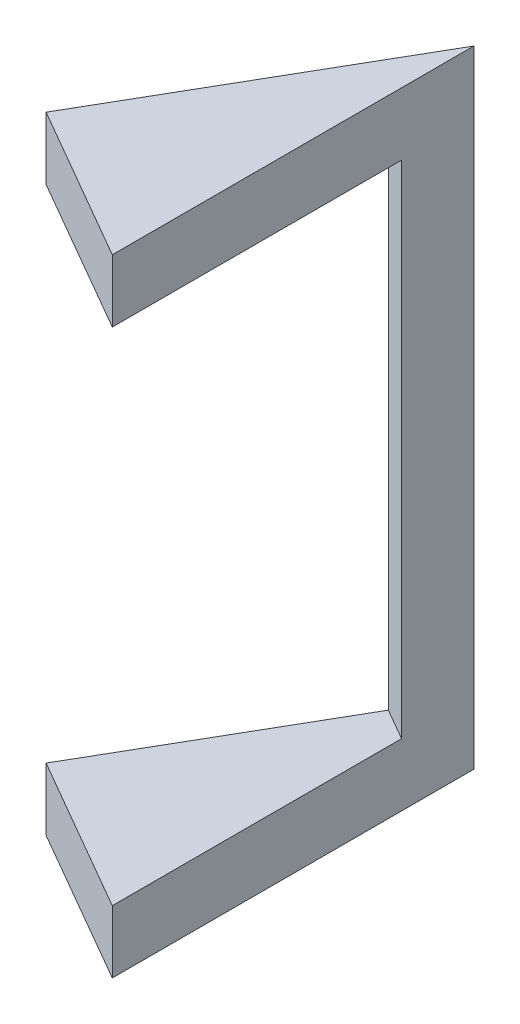
ISO-10303-21;
HEADER;
FILE_DESCRIPTION(('STEP AP214'),'2;1');
FILE_NAME('part.step','',(''),(''),'','','');
FILE_SCHEMA(('AUTOMOTIVE_DESIGN { 1 0 10303 214 1 1 1 1 }'));
ENDSEC;
DATA;
#1=APPLICATION_CONTEXT('core data for automotive mechanical design processes');
#2=APPLICATION_PROTOCOL_DEFINITION('international standard','automotive_design',2000,#1);
#3=PRODUCT_CONTEXT('',#1,'mechanical');
#4=PRODUCT('Part','Part','',(#3));
#5=PRODUCT_RELATED_PRODUCT_CATEGORY('part','',(#4));
#6=PRODUCT_DEFINITION_FORMATION('','',#4);
#7=PRODUCT_DEFINITION_CONTEXT('part definition',#1,'design');
#8=PRODUCT_DEFINITION('design','',#6,#7);
#9=PRODUCT_DEFINITION_SHAPE('','',#8);
#10=(LENGTH_UNIT() NAMED_UNIT(*) SI_UNIT(.MILLI.,.METRE.));
#11=(NAMED_UNIT(*) PLANE_ANGLE_UNIT() SI_UNIT($,.RADIAN.));
#12=(NAMED_UNIT(*) SI_UNIT($,.STERADIAN.) SOLID_ANGLE_UNIT());
#13=UNCERTAINTY_MEASURE_WITH_UNIT(LENGTH_MEASURE(1.E-05),#10,'distance_accuracy_value','');
#14=(GEOMETRIC_REPRESENTATION_CONTEXT(3) GLOBAL_UNCERTAINTY_ASSIGNED_CONTEXT((#13)) GLOBAL_UNIT_ASSIGNED_CONTEXT((#10,
#11,#12)) REPRESENTATION_CONTEXT('',''));
#15=CARTESIAN_POINT('',(0.,0.,0.));
#16=DIRECTION('',(0.,0.,1.));
#17=DIRECTION('',(1.,0.,0.));
#18=AXIS2_PLACEMENT_3D('',#15,#16,#17);
#19=CARTESIAN_POINT('',(1.,0.,0.));
#20=DIRECTION('',(-1.,0.,0.));
#21=DIRECTION('',(0.,1.,0.));
#22=AXIS2_PLACEMENT_3D('',#19,#20,#21);
#23=PLANE('',#22);
#24=DIRECTION('',(0.,0.,1.));
#25=VECTOR('',#24,1.);
#26=CARTESIAN_POINT('',(1.,8.,0.577350269189627));
#27=LINE('',#26,#25);
#28=CARTESIAN_POINT('',(1.,8.,0.577350269189627));
#29=VERTEX_POINT('',#28);
#30=CARTESIAN_POINT('',(1.,8.,9.81495457622364));
#31=VERTEX_POINT('',#30);
#32=EDGE_CURVE('E10',#29,#31,#27,.T.);
#33=ORIENTED_EDGE('',*,*,#32,.F.);
#34=DIRECTION('',(0.,1.,0.));
#35=VECTOR('',#34,1.);
#36=CARTESIAN_POINT('',(1.,-8.,0.577350269189625));
#37=LINE('',#36,#35);
#38=CARTESIAN_POINT('',(1.,-8.,0.577350269189625));
#39=VERTEX_POINT('',#38);
#40=EDGE_CURVE('E90',#39,#29,#37,.T.);
#41=ORIENTED_EDGE('',*,*,#40,.F.);
#42=DIRECTION('',(0.,0.,-1.));
#43=VECTOR('',#42,1.);
#44=CARTESIAN_POINT('',(1.,-8.,9.81495457622364));
#45=LINE('',#44,#43);
#46=CARTESIAN_POINT('',(1.,-8.,9.81495457622364));
#47=VERTEX_POINT('',#46);
#48=EDGE_CURVE('E124',#47,#39,#45,.T.);
#49=ORIENTED_EDGE('',*,*,#48,.F.);
#50=DIRECTION('',(0.,1.,0.));
#51=VECTOR('',#50,1.);
#52=CARTESIAN_POINT('',(1.,-10.,9.81495457622363));
#53=LINE('',#52,#51);
#54=CARTESIAN_POINT('',(1.,-10.,9.81495457622364));
#55=VERTEX_POINT('',#54);
#56=EDGE_CURVE('E113',#55,#47,#53,.T.);
#57=ORIENTED_EDGE('',*,*,#56,.F.);
#58=DIRECTION('',(0.,0.,1.));
#59=VECTOR('',#58,1.);
#60=CARTESIAN_POINT('',(1.,-10.,-1.73205080756888));
#61=LINE('',#60,#59);
#62=CARTESIAN_POINT('',(1.,-10.,-1.73205080756888));
#63=VERTEX_POINT('',#62);
#64=EDGE_CURVE('E110',#63,#55,#61,.T.);
#65=ORIENTED_EDGE('',*,*,#64,.F.);
#66=DIRECTION('',(0.,1.,0.));
#67=VECTOR('',#66,1.);
#68=CARTESIAN_POINT('',(1.,-10.,-1.73205080756888));
#69=LINE('',#68,#67);
#70=CARTESIAN_POINT('',(0.999999999999998,10.,-1.73205080756888));
#71=VERTEX_POINT('',#70);
#72=EDGE_CURVE('E23',#63,#71,#69,.T.);
#73=ORIENTED_EDGE('',*,*,#72,.T.);
#74=DIRECTION('',(0.,0.,-1.));
#75=VECTOR('',#74,1.);
#76=CARTESIAN_POINT('',(1.,10.,9.81495457622364));
#77=LINE('',#76,#75);
#78=CARTESIAN_POINT('',(1.,10.,9.81495457622364));
#79=VERTEX_POINT('',#78);
#80=EDGE_CURVE('E122',#79,#71,#77,.T.);
#81=ORIENTED_EDGE('',*,*,#80,.F.);
#82=DIRECTION('',(0.,1.,0.));
#83=VECTOR('',#82,1.);
#84=CARTESIAN_POINT('',(1.,8.,9.81495457622364));
#85=LINE('',#84,#83);
#86=EDGE_CURVE('E130',#31,#79,#85,.T.);
#87=ORIENTED_EDGE('',*,*,#86,.F.);
#88=EDGE_LOOP('',(#33,#41,#49,#57,#65,#73,#81,#87));
#89=FACE_BOUND('',#88,.T.);
#90=ADVANCED_FACE('F16',(#89),#23,.F.);
#91=CARTESIAN_POINT('',(0.,0.,0.));
#92=DIRECTION('',(0.866025403784439,0.,0.5));
#93=DIRECTION('',(0.,1.,0.));
#94=AXIS2_PLACEMENT_3D('',#91,#92,#93);
#95=PLANE('',#94);
#96=ORIENTED_EDGE('',*,*,#72,.F.);
#97=DIRECTION('',(0.5,0.,-0.866025403784439));
#98=VECTOR('',#97,1.);
#99=CARTESIAN_POINT('',(-4.,-10.,6.92820323027551));
#100=LINE('',#99,#98);
#101=CARTESIAN_POINT('',(-4.,-10.,6.92820323027551));
#102=VERTEX_POINT('',#101);
#103=EDGE_CURVE('E127',#102,#63,#100,.T.);
#104=ORIENTED_EDGE('',*,*,#103,.F.);
#105=DIRECTION('',(0.,-1.,0.));
#106=VECTOR('',#105,1.);
#107=CARTESIAN_POINT('',(-4.,-8.,6.92820323027551));
#108=LINE('',#107,#106);
#109=CARTESIAN_POINT('',(-4.,-8.,6.92820323027551));
#110=VERTEX_POINT('',#109);
#111=EDGE_CURVE('E116',#110,#102,#108,.T.);
#112=ORIENTED_EDGE('',*,*,#111,.F.);
#113=DIRECTION('',(-0.5,0.,0.866025403784439));
#114=VECTOR('',#113,1.);
#115=CARTESIAN_POINT('',(0.,-8.,0.));
#116=LINE('',#115,#114);
#117=CARTESIAN_POINT('',(0.,-8.,0.));
#118=VERTEX_POINT('',#117);
#119=EDGE_CURVE('E80',#118,#110,#116,.T.);
#120=ORIENTED_EDGE('',*,*,#119,.F.);
#121=DIRECTION('',(0.,-1.,0.));
#122=VECTOR('',#121,1.);
#123=CARTESIAN_POINT('',(0.,8.,0.));
#124=LINE('',#123,#122);
#125=CARTESIAN_POINT('',(0.,8.,0.));
#126=VERTEX_POINT('',#125);
#127=EDGE_CURVE('E72',#126,#118,#124,.T.);
#128=ORIENTED_EDGE('',*,*,#127,.F.);
#129=DIRECTION('',(0.5,0.,-0.866025403784439));
#130=VECTOR('',#129,1.);
#131=CARTESIAN_POINT('',(-4.,8.,6.92820323027551));
#132=LINE('',#131,#130);
#133=CARTESIAN_POINT('',(-4.,8.,6.92820323027551));
#134=VERTEX_POINT('',#133);
#135=EDGE_CURVE('E77',#134,#126,#132,.T.);
#136=ORIENTED_EDGE('',*,*,#135,.F.);
#137=DIRECTION('',(0.,-1.,0.));
#138=VECTOR('',#137,1.);
#139=CARTESIAN_POINT('',(-4.,10.,6.92820323027551));
#140=LINE('',#139,#138);
#141=CARTESIAN_POINT('',(-4.,10.,6.92820323027551));
#142=VERTEX_POINT('',#141);
#143=EDGE_CURVE('E105',#142,#134,#140,.T.);
#144=ORIENTED_EDGE('',*,*,#143,.F.);
#145=DIRECTION('',(-0.5,0.,0.866025403784439));
#146=VECTOR('',#145,1.);
#147=CARTESIAN_POINT('',(0.999999999999998,10.,-1.73205080756888));
#148=LINE('',#147,#146);
#149=EDGE_CURVE('E107',#71,#142,#148,.T.);
#150=ORIENTED_EDGE('',*,*,#149,.F.);
#151=EDGE_LOOP('',(#96,#104,#112,#120,#128,#136,#144,#150));
#152=FACE_BOUND('',#151,.T.);
#153=ADVANCED_FACE('F74',(#152),#95,.F.);
#154=CARTESIAN_POINT('',(-4.,10.,6.92820323027551));
#155=DIRECTION('',(-0.5,0.,0.866025403784439));
#156=DIRECTION('',(0.,-1.,0.));
#157=AXIS2_PLACEMENT_3D('',#154,#155,#156);
#158=PLANE('',#157);
#159=ORIENTED_EDGE('',*,*,#86,.T.);
#160=DIRECTION('',(0.866025403784439,0.,0.5));
#161=VECTOR('',#160,1.);
#162=CARTESIAN_POINT('',(-4.,10.,6.92820323027551));
#163=LINE('',#162,#161);
#164=EDGE_CURVE('E119',#142,#79,#163,.T.);
#165=ORIENTED_EDGE('',*,*,#164,.F.);
#166=ORIENTED_EDGE('',*,*,#143,.T.);
#167=DIRECTION('',(0.866025403784439,0.,0.5));
#168=VECTOR('',#167,1.);
#169=CARTESIAN_POINT('',(-4.,8.,6.92820323027551));
#170=LINE('',#169,#168);
#171=EDGE_CURVE('E84',#134,#31,#170,.T.);
#172=ORIENTED_EDGE('',*,*,#171,.T.);
#173=EDGE_LOOP('',(#159,#165,#166,#172));
#174=FACE_BOUND('',#173,.T.);
#175=ADVANCED_FACE('F136',(#174),#158,.T.);
#176=CARTESIAN_POINT('',(0.999999999999998,10.,-1.73205080756888));
#177=DIRECTION('',(0.,1.,0.));
#178=DIRECTION('',(-0.5,0.,0.866025403784439));
#179=AXIS2_PLACEMENT_3D('',#176,#177,#178);
#180=PLANE('',#179);
#181=ORIENTED_EDGE('',*,*,#80,.T.);
#182=ORIENTED_EDGE('',*,*,#149,.T.);
#183=ORIENTED_EDGE('',*,*,#164,.T.);
#184=EDGE_LOOP('',(#181,#182,#183));
#185=FACE_BOUND('',#184,.T.);
#186=ADVANCED_FACE('F134',(#185),#180,.T.);
#187=CARTESIAN_POINT('',(-4.,-10.,6.92820323027551));
#188=DIRECTION('',(0.,-1.,0.));
#189=DIRECTION('',(0.5,0.,-0.866025403784439));
#190=AXIS2_PLACEMENT_3D('',#187,#188,#189);
#191=PLANE('',#190);
#192=ORIENTED_EDGE('',*,*,#64,.T.);
#193=DIRECTION('',(0.866025403784439,0.,0.5));
#194=VECTOR('',#193,1.);
#195=CARTESIAN_POINT('',(-4.,-10.,6.92820323027551));
#196=LINE('',#195,#194);
#197=EDGE_CURVE('E101',#102,#55,#196,.T.);
#198=ORIENTED_EDGE('',*,*,#197,.F.);
#199=ORIENTED_EDGE('',*,*,#103,.T.);
#200=EDGE_LOOP('',(#192,#198,#199));
#201=FACE_BOUND('',#200,.T.);
#202=ADVANCED_FACE('F144',(#201),#191,.T.);
#203=CARTESIAN_POINT('',(-4.,-8.,6.92820323027551));
#204=DIRECTION('',(-0.5,0.,0.866025403784439));
#205=DIRECTION('',(0.,-1.,0.));
#206=AXIS2_PLACEMENT_3D('',#203,#204,#205);
#207=PLANE('',#206);
#208=ORIENTED_EDGE('',*,*,#56,.T.);
#209=DIRECTION('',(0.866025403784439,0.,0.5));
#210=VECTOR('',#209,1.);
#211=CARTESIAN_POINT('',(-4.,-8.,6.92820323027551));
#212=LINE('',#211,#210);
#213=EDGE_CURVE('E85',#110,#47,#212,.T.);
#214=ORIENTED_EDGE('',*,*,#213,.F.);
#215=ORIENTED_EDGE('',*,*,#111,.T.);
#216=ORIENTED_EDGE('',*,*,#197,.T.);
#217=EDGE_LOOP('',(#208,#214,#215,#216));
#218=FACE_BOUND('',#217,.T.);
#219=ADVANCED_FACE('F185',(#218),#207,.T.);
#220=CARTESIAN_POINT('',(0.,-8.,0.));
#221=DIRECTION('',(0.,1.,0.));
#222=DIRECTION('',(-0.5,0.,0.866025403784439));
#223=AXIS2_PLACEMENT_3D('',#220,#221,#222);
#224=PLANE('',#223);
#225=ORIENTED_EDGE('',*,*,#48,.T.);
#226=DIRECTION('',(0.866025403784439,0.,0.5));
#227=VECTOR('',#226,1.);
#228=CARTESIAN_POINT('',(0.,-8.,0.));
#229=LINE('',#228,#227);
#230=EDGE_CURVE('E92',#118,#39,#229,.T.);
#231=ORIENTED_EDGE('',*,*,#230,.F.);
#232=ORIENTED_EDGE('',*,*,#119,.T.);
#233=ORIENTED_EDGE('',*,*,#213,.T.);
#234=EDGE_LOOP('',(#225,#231,#232,#233));
#235=FACE_BOUND('',#234,.T.);
#236=ADVANCED_FACE('F196',(#235),#224,.T.);
#237=CARTESIAN_POINT('',(0.,8.,0.));
#238=DIRECTION('',(-0.5,0.,0.866025403784439));
#239=DIRECTION('',(0.,-1.,0.));
#240=AXIS2_PLACEMENT_3D('',#237,#238,#239);
#241=PLANE('',#240);
#242=ORIENTED_EDGE('',*,*,#40,.T.);
#243=DIRECTION('',(0.866025403784439,0.,0.5));
#244=VECTOR('',#243,1.);
#245=CARTESIAN_POINT('',(0.,8.,0.));
#246=LINE('',#245,#244);
#247=EDGE_CURVE('E88',#126,#29,#246,.T.);
#248=ORIENTED_EDGE('',*,*,#247,.F.);
#249=ORIENTED_EDGE('',*,*,#127,.T.);
#250=ORIENTED_EDGE('',*,*,#230,.T.);
#251=EDGE_LOOP('',(#242,#248,#249,#250));
#252=FACE_BOUND('',#251,.T.);
#253=ADVANCED_FACE('F89',(#252),#241,.T.);
#254=CARTESIAN_POINT('',(-4.,8.,6.92820323027551));
#255=DIRECTION('',(0.,-1.,0.));
#256=DIRECTION('',(0.5,0.,-0.866025403784439));
#257=AXIS2_PLACEMENT_3D('',#254,#255,#256);
#258=PLANE('',#257);
#259=ORIENTED_EDGE('',*,*,#32,.T.);
#260=ORIENTED_EDGE('',*,*,#171,.F.);
#261=ORIENTED_EDGE('',*,*,#135,.T.);
#262=ORIENTED_EDGE('',*,*,#247,.T.);
#263=EDGE_LOOP('',(#259,#260,#261,#262));
#264=FACE_BOUND('',#263,.T.);
#265=ADVANCED_FACE('F94',(#264),#258,.T.);
#266=CLOSED_SHELL('',(#90,#153,#175,#186,#202,#219,#236,#253,#265));
#267=MANIFOLD_SOLID_BREP('B1',#266);
#268=ADVANCED_BREP_SHAPE_REPRESENTATION('',(#18,#267),#14);
#269=SHAPE_DEFINITION_REPRESENTATION(#9,#268);
ENDSEC;
END-ISO-10303-21;
